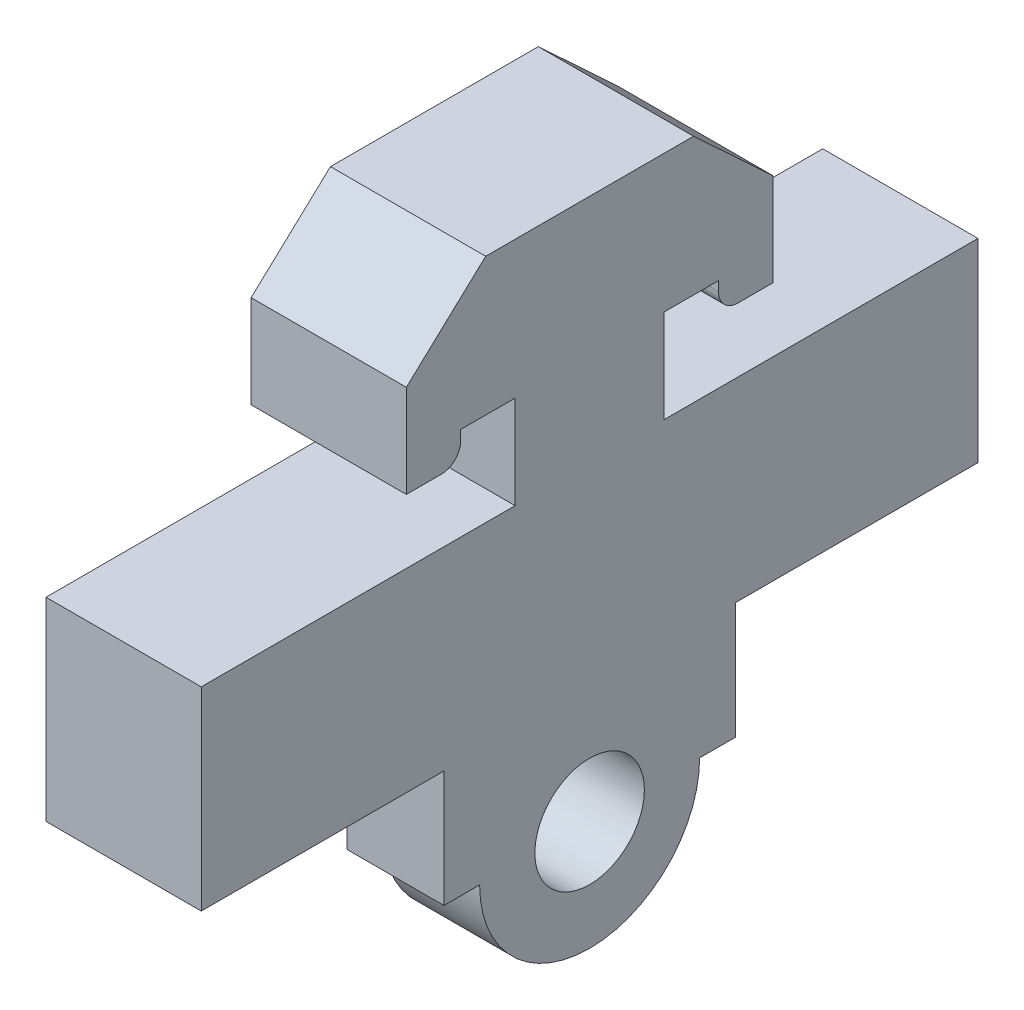
ISO-10303-21;
HEADER;
FILE_DESCRIPTION(('STEP AP214'),'2;1');
FILE_NAME('part.step','',(''),(''),'','','');
FILE_SCHEMA(('AUTOMOTIVE_DESIGN { 1 0 10303 214 1 1 1 1 }'));
ENDSEC;
DATA;
#1=APPLICATION_CONTEXT('core data for automotive mechanical design processes');
#2=APPLICATION_PROTOCOL_DEFINITION('international standard','automotive_design',2000,#1);
#3=PRODUCT_CONTEXT('',#1,'mechanical');
#4=PRODUCT('Part','Part','',(#3));
#5=PRODUCT_RELATED_PRODUCT_CATEGORY('part','',(#4));
#6=PRODUCT_DEFINITION_FORMATION('','',#4);
#7=PRODUCT_DEFINITION_CONTEXT('part definition',#1,'design');
#8=PRODUCT_DEFINITION('design','',#6,#7);
#9=PRODUCT_DEFINITION_SHAPE('','',#8);
#10=(LENGTH_UNIT() NAMED_UNIT(*) SI_UNIT(.MILLI.,.METRE.));
#11=(NAMED_UNIT(*) PLANE_ANGLE_UNIT() SI_UNIT($,.RADIAN.));
#12=(NAMED_UNIT(*) SI_UNIT($,.STERADIAN.) SOLID_ANGLE_UNIT());
#13=UNCERTAINTY_MEASURE_WITH_UNIT(LENGTH_MEASURE(1.E-05),#10,'distance_accuracy_value','');
#14=(GEOMETRIC_REPRESENTATION_CONTEXT(3) GLOBAL_UNCERTAINTY_ASSIGNED_CONTEXT((#13)) GLOBAL_UNIT_ASSIGNED_CONTEXT((#10,
#11,#12)) REPRESENTATION_CONTEXT('',''));
#15=CARTESIAN_POINT('',(0.,0.,0.));
#16=DIRECTION('',(0.,0.,1.));
#17=DIRECTION('',(1.,0.,0.));
#18=AXIS2_PLACEMENT_3D('',#15,#16,#17);
#19=CARTESIAN_POINT('',(0.,10.,0.));
#20=DIRECTION('',(0.,-1.,0.));
#21=DIRECTION('',(0.,0.,-1.));
#22=AXIS2_PLACEMENT_3D('',#19,#20,#21);
#23=PLANE('',#22);
#24=DIRECTION('',(-1.,0.,0.));
#25=VECTOR('',#24,1.);
#26=CARTESIAN_POINT('',(-37.5,10.,-20.));
#27=LINE('',#26,#25);
#28=CARTESIAN_POINT('',(42.5,10.,-20.));
#29=VERTEX_POINT('',#28);
#30=CARTESIAN_POINT('',(34.5049002985895,10.,-20.));
#31=VERTEX_POINT('',#30);
#32=EDGE_CURVE('E344',#29,#31,#27,.T.);
#33=ORIENTED_EDGE('',*,*,#32,.T.);
#34=DIRECTION('',(0.,0.,1.));
#35=VECTOR('',#34,1.);
#36=CARTESIAN_POINT('',(34.5049002985895,10.,0.));
#37=LINE('',#36,#35);
#38=CARTESIAN_POINT('',(34.5049002985895,10.,-3.83822735647703));
#39=VERTEX_POINT('',#38);
#40=EDGE_CURVE('E399',#31,#39,#37,.T.);
#41=ORIENTED_EDGE('',*,*,#40,.T.);
#42=DIRECTION('',(-1.,0.,0.));
#43=VECTOR('',#42,1.);
#44=CARTESIAN_POINT('',(64.8036979563974,10.,-3.83822735647703));
#45=LINE('',#44,#43);
#46=CARTESIAN_POINT('',(42.5,10.,-3.83822735647703));
#47=VERTEX_POINT('',#46);
#48=EDGE_CURVE('E267',#47,#39,#45,.T.);
#49=ORIENTED_EDGE('',*,*,#48,.F.);
#50=DIRECTION('',(0.,0.,1.));
#51=VECTOR('',#50,1.);
#52=CARTESIAN_POINT('',(42.5,10.,0.));
#53=LINE('',#52,#51);
#54=EDGE_CURVE('E302',#29,#47,#53,.T.);
#55=ORIENTED_EDGE('',*,*,#54,.F.);
#56=EDGE_LOOP('',(#33,#41,#49,#55));
#57=FACE_BOUND('',#56,.T.);
#58=ADVANCED_FACE('F41',(#57),#23,.F.);
#59=CARTESIAN_POINT('',(-37.5,10.,-20.));
#60=DIRECTION('',(0.,0.,1.));
#61=DIRECTION('',(1.,0.,0.));
#62=AXIS2_PLACEMENT_3D('',#59,#60,#61);
#63=PLANE('',#62);
#64=DIRECTION('',(-1.,0.,0.));
#65=VECTOR('',#64,1.);
#66=CARTESIAN_POINT('',(-37.5,0.,-20.));
#67=LINE('',#66,#65);
#68=CARTESIAN_POINT('',(42.5,0.,-20.));
#69=VERTEX_POINT('',#68);
#70=CARTESIAN_POINT('',(34.5049002985895,0.,-20.));
#71=VERTEX_POINT('',#70);
#72=EDGE_CURVE('E350',#69,#71,#67,.T.);
#73=ORIENTED_EDGE('',*,*,#72,.T.);
#74=DIRECTION('',(0.,1.,0.));
#75=VECTOR('',#74,1.);
#76=CARTESIAN_POINT('',(34.5049002985895,-50.12,-20.));
#77=LINE('',#76,#75);
#78=EDGE_CURVE('E233',#71,#31,#77,.T.);
#79=ORIENTED_EDGE('',*,*,#78,.T.);
#80=ORIENTED_EDGE('',*,*,#32,.F.);
#81=DIRECTION('',(0.,1.,0.));
#82=VECTOR('',#81,1.);
#83=CARTESIAN_POINT('',(42.5,0.,-20.));
#84=LINE('',#83,#82);
#85=EDGE_CURVE('E298',#69,#29,#84,.T.);
#86=ORIENTED_EDGE('',*,*,#85,.F.);
#87=EDGE_LOOP('',(#73,#79,#80,#86));
#88=FACE_BOUND('',#87,.T.);
#89=ADVANCED_FACE('F43',(#88),#63,.F.);
#90=CARTESIAN_POINT('',(-37.5,10.,20.));
#91=DIRECTION('',(0.,0.,-1.));
#92=DIRECTION('',(-1.,0.,0.));
#93=AXIS2_PLACEMENT_3D('',#90,#91,#92);
#94=PLANE('',#93);
#95=DIRECTION('',(1.,0.,0.));
#96=VECTOR('',#95,1.);
#97=CARTESIAN_POINT('',(-37.5,10.,20.));
#98=LINE('',#97,#96);
#99=CARTESIAN_POINT('',(34.5049002985895,10.,20.));
#100=VERTEX_POINT('',#99);
#101=CARTESIAN_POINT('',(42.5,10.,20.));
#102=VERTEX_POINT('',#101);
#103=EDGE_CURVE('E49',#100,#102,#98,.T.);
#104=ORIENTED_EDGE('',*,*,#103,.F.);
#105=DIRECTION('',(0.,1.,0.));
#106=VECTOR('',#105,1.);
#107=CARTESIAN_POINT('',(34.5049002985895,-50.12,20.));
#108=LINE('',#107,#106);
#109=CARTESIAN_POINT('',(34.5049002985895,0.,20.));
#110=VERTEX_POINT('',#109);
#111=EDGE_CURVE('E358',#110,#100,#108,.T.);
#112=ORIENTED_EDGE('',*,*,#111,.F.);
#113=DIRECTION('',(1.,0.,0.));
#114=VECTOR('',#113,1.);
#115=CARTESIAN_POINT('',(-37.5,0.,20.));
#116=LINE('',#115,#114);
#117=CARTESIAN_POINT('',(42.5,0.,20.));
#118=VERTEX_POINT('',#117);
#119=EDGE_CURVE('E347',#110,#118,#116,.T.);
#120=ORIENTED_EDGE('',*,*,#119,.T.);
#121=DIRECTION('',(0.,-1.,0.));
#122=VECTOR('',#121,1.);
#123=CARTESIAN_POINT('',(42.5,0.,20.));
#124=LINE('',#123,#122);
#125=EDGE_CURVE('E305',#102,#118,#124,.T.);
#126=ORIENTED_EDGE('',*,*,#125,.F.);
#127=EDGE_LOOP('',(#104,#112,#120,#126));
#128=FACE_BOUND('',#127,.T.);
#129=ADVANCED_FACE('F357',(#128),#94,.F.);
#130=DIRECTION('',(-1.,0.,0.));
#131=VECTOR('',#130,1.);
#132=CARTESIAN_POINT('',(64.8036979563974,10.,3.83822735647703));
#133=LINE('',#132,#131);
#134=CARTESIAN_POINT('',(42.5,10.,3.83822735647703));
#135=VERTEX_POINT('',#134);
#136=CARTESIAN_POINT('',(34.5049002985895,10.,3.83822735647703));
#137=VERTEX_POINT('',#136);
#138=EDGE_CURVE('E265',#135,#137,#133,.T.);
#139=ORIENTED_EDGE('',*,*,#138,.T.);
#140=DIRECTION('',(0.,0.,1.));
#141=VECTOR('',#140,1.);
#142=CARTESIAN_POINT('',(34.5049002985895,10.,0.));
#143=LINE('',#142,#141);
#144=EDGE_CURVE('E223',#137,#100,#143,.T.);
#145=ORIENTED_EDGE('',*,*,#144,.T.);
#146=ORIENTED_EDGE('',*,*,#103,.T.);
#147=EDGE_CURVE('E63',#135,#102,#53,.T.);
#148=ORIENTED_EDGE('',*,*,#147,.F.);
#149=EDGE_LOOP('',(#139,#145,#146,#148));
#150=FACE_BOUND('',#149,.T.);
#151=ADVANCED_FACE('F497',(#150),#23,.F.);
#152=CARTESIAN_POINT('',(0.,0.,0.));
#153=DIRECTION('',(0.,-1.,0.));
#154=DIRECTION('',(0.,0.,-1.));
#155=AXIS2_PLACEMENT_3D('',#152,#153,#154);
#156=PLANE('',#155);
#157=DIRECTION('',(0.,0.,1.));
#158=VECTOR('',#157,1.);
#159=CARTESIAN_POINT('',(34.5049002985895,0.,0.));
#160=LINE('',#159,#158);
#161=EDGE_CURVE('E281',#71,#110,#160,.T.);
#162=ORIENTED_EDGE('',*,*,#161,.F.);
#163=ORIENTED_EDGE('',*,*,#72,.F.);
#164=DIRECTION('',(0.,0.,-1.));
#165=VECTOR('',#164,1.);
#166=CARTESIAN_POINT('',(42.5,0.,0.));
#167=LINE('',#166,#165);
#168=CARTESIAN_POINT('',(42.5,0.,-7.5));
#169=VERTEX_POINT('',#168);
#170=EDGE_CURVE('E295',#169,#69,#167,.T.);
#171=ORIENTED_EDGE('',*,*,#170,.F.);
#172=DIRECTION('',(-1.,0.,0.));
#173=VECTOR('',#172,1.);
#174=CARTESIAN_POINT('',(42.5,0.,-7.5));
#175=LINE('',#174,#173);
#176=CARTESIAN_POINT('',(37.5,0.,-7.5));
#177=VERTEX_POINT('',#176);
#178=EDGE_CURVE('E331',#169,#177,#175,.T.);
#179=ORIENTED_EDGE('',*,*,#178,.T.);
#180=DIRECTION('',(0.,0.,-1.));
#181=VECTOR('',#180,1.);
#182=CARTESIAN_POINT('',(37.5,0.,20.));
#183=LINE('',#182,#181);
#184=CARTESIAN_POINT('',(37.5,0.,7.5));
#185=VERTEX_POINT('',#184);
#186=EDGE_CURVE('E343',#185,#177,#183,.T.);
#187=ORIENTED_EDGE('',*,*,#186,.F.);
#188=DIRECTION('',(-1.,0.,0.));
#189=VECTOR('',#188,1.);
#190=CARTESIAN_POINT('',(42.5,0.,7.5));
#191=LINE('',#190,#189);
#192=CARTESIAN_POINT('',(42.5,0.,7.5));
#193=VERTEX_POINT('',#192);
#194=EDGE_CURVE('E328',#193,#185,#191,.T.);
#195=ORIENTED_EDGE('',*,*,#194,.F.);
#196=EDGE_CURVE('E299',#118,#193,#167,.T.);
#197=ORIENTED_EDGE('',*,*,#196,.F.);
#198=ORIENTED_EDGE('',*,*,#119,.F.);
#199=EDGE_LOOP('',(#162,#163,#171,#179,#187,#195,#197,#198));
#200=FACE_BOUND('',#199,.T.);
#201=ADVANCED_FACE('F366',(#200),#156,.T.);
#202=CARTESIAN_POINT('',(37.5,0.,0.));
#203=DIRECTION('',(1.,0.,0.));
#204=DIRECTION('',(0.,0.,-1.));
#205=AXIS2_PLACEMENT_3D('',#202,#203,#204);
#206=PLANE('',#205);
#207=CARTESIAN_POINT('',(37.5,-6.,0.));
#208=DIRECTION('',(1.,0.,0.));
#209=DIRECTION('',(0.,0.,-1.));
#210=AXIS2_PLACEMENT_3D('',#207,#208,#209);
#211=CIRCLE('',#210,2.82);
#212=CARTESIAN_POINT('',(37.5,-6.,-2.82));
#213=VERTEX_POINT('',#212);
#214=EDGE_CURVE('E311',#213,#213,#211,.T.);
#215=ORIENTED_EDGE('',*,*,#214,.T.);
#216=EDGE_LOOP('',(#215));
#217=FACE_BOUND('',#216,.T.);
#218=DIRECTION('',(0.,-1.,0.));
#219=VECTOR('',#218,1.);
#220=CARTESIAN_POINT('',(37.5,0.,7.5));
#221=LINE('',#220,#219);
#222=CARTESIAN_POINT('',(37.5,-6.,7.5));
#223=VERTEX_POINT('',#222);
#224=EDGE_CURVE('E286',#185,#223,#221,.T.);
#225=ORIENTED_EDGE('',*,*,#224,.F.);
#226=ORIENTED_EDGE('',*,*,#186,.T.);
#227=DIRECTION('',(0.,1.,0.));
#228=VECTOR('',#227,1.);
#229=CARTESIAN_POINT('',(37.5,0.,-7.5));
#230=LINE('',#229,#228);
#231=CARTESIAN_POINT('',(37.5,-6.,-7.5));
#232=VERTEX_POINT('',#231);
#233=EDGE_CURVE('E322',#232,#177,#230,.T.);
#234=ORIENTED_EDGE('',*,*,#233,.F.);
#235=DIRECTION('',(0.,0.,-1.));
#236=VECTOR('',#235,1.);
#237=CARTESIAN_POINT('',(37.5,-6.,0.));
#238=LINE('',#237,#236);
#239=CARTESIAN_POINT('',(37.5,-6.,-5.665));
#240=VERTEX_POINT('',#239);
#241=EDGE_CURVE('E320',#240,#232,#238,.T.);
#242=ORIENTED_EDGE('',*,*,#241,.F.);
#243=CARTESIAN_POINT('',(37.5,-6.,0.));
#244=DIRECTION('',(1.,0.,0.));
#245=DIRECTION('',(0.,0.,-1.));
#246=AXIS2_PLACEMENT_3D('',#243,#244,#245);
#247=CIRCLE('',#246,5.665);
#248=CARTESIAN_POINT('',(37.5,-6.,5.665));
#249=VERTEX_POINT('',#248);
#250=EDGE_CURVE('E318',#249,#240,#247,.T.);
#251=ORIENTED_EDGE('',*,*,#250,.F.);
#252=DIRECTION('',(0.,0.,-1.));
#253=VECTOR('',#252,1.);
#254=CARTESIAN_POINT('',(37.5,-6.,0.));
#255=LINE('',#254,#253);
#256=EDGE_CURVE('E314',#223,#249,#255,.T.);
#257=ORIENTED_EDGE('',*,*,#256,.F.);
#258=EDGE_LOOP('',(#225,#226,#234,#242,#251,#257));
#259=FACE_BOUND('',#258,.T.);
#260=ADVANCED_FACE('F509',(#217,#259),#206,.F.);
#261=CARTESIAN_POINT('',(42.5,-6.,0.));
#262=DIRECTION('',(0.,1.,0.));
#263=DIRECTION('',(0.,0.,1.));
#264=AXIS2_PLACEMENT_3D('',#261,#262,#263);
#265=PLANE('',#264);
#266=ORIENTED_EDGE('',*,*,#256,.T.);
#267=DIRECTION('',(-1.,0.,0.));
#268=VECTOR('',#267,1.);
#269=CARTESIAN_POINT('',(42.5,-6.,5.665));
#270=LINE('',#269,#268);
#271=CARTESIAN_POINT('',(42.5,-6.,5.665));
#272=VERTEX_POINT('',#271);
#273=EDGE_CURVE('E340',#272,#249,#270,.T.);
#274=ORIENTED_EDGE('',*,*,#273,.F.);
#275=DIRECTION('',(0.,0.,-1.));
#276=VECTOR('',#275,1.);
#277=CARTESIAN_POINT('',(42.5,-6.,0.));
#278=LINE('',#277,#276);
#279=CARTESIAN_POINT('',(42.5,-6.,7.5));
#280=VERTEX_POINT('',#279);
#281=EDGE_CURVE('E285',#280,#272,#278,.T.);
#282=ORIENTED_EDGE('',*,*,#281,.F.);
#283=DIRECTION('',(-1.,0.,0.));
#284=VECTOR('',#283,1.);
#285=CARTESIAN_POINT('',(42.5,-6.,7.5));
#286=LINE('',#285,#284);
#287=EDGE_CURVE('E310',#280,#223,#286,.T.);
#288=ORIENTED_EDGE('',*,*,#287,.T.);
#289=EDGE_LOOP('',(#266,#274,#282,#288));
#290=FACE_BOUND('',#289,.T.);
#291=ADVANCED_FACE('F376',(#290),#265,.F.);
#292=CARTESIAN_POINT('',(42.5,-6.,0.));
#293=DIRECTION('',(-1.,0.,0.));
#294=DIRECTION('',(0.,0.,1.));
#295=AXIS2_PLACEMENT_3D('',#292,#293,#294);
#296=CYLINDRICAL_SURFACE('',#295,5.665);
#297=ORIENTED_EDGE('',*,*,#250,.T.);
#298=DIRECTION('',(-1.,0.,0.));
#299=VECTOR('',#298,1.);
#300=CARTESIAN_POINT('',(42.5,-6.,-5.665));
#301=LINE('',#300,#299);
#302=CARTESIAN_POINT('',(42.5,-6.,-5.665));
#303=VERTEX_POINT('',#302);
#304=EDGE_CURVE('E337',#303,#240,#301,.T.);
#305=ORIENTED_EDGE('',*,*,#304,.F.);
#306=CARTESIAN_POINT('',(42.5,-6.,0.));
#307=DIRECTION('',(1.,0.,0.));
#308=DIRECTION('',(0.,0.,-1.));
#309=AXIS2_PLACEMENT_3D('',#306,#307,#308);
#310=CIRCLE('',#309,5.665);
#311=EDGE_CURVE('E289',#272,#303,#310,.T.);
#312=ORIENTED_EDGE('',*,*,#311,.F.);
#313=ORIENTED_EDGE('',*,*,#273,.T.);
#314=EDGE_LOOP('',(#297,#305,#312,#313));
#315=FACE_BOUND('',#314,.T.);
#316=ADVANCED_FACE('F379',(#315),#296,.T.);
#317=CARTESIAN_POINT('',(42.5,-6.,0.));
#318=DIRECTION('',(0.,1.,0.));
#319=DIRECTION('',(0.,0.,1.));
#320=AXIS2_PLACEMENT_3D('',#317,#318,#319);
#321=PLANE('',#320);
#322=ORIENTED_EDGE('',*,*,#241,.T.);
#323=DIRECTION('',(-1.,0.,0.));
#324=VECTOR('',#323,1.);
#325=CARTESIAN_POINT('',(42.5,-6.,-7.5));
#326=LINE('',#325,#324);
#327=CARTESIAN_POINT('',(42.5,-6.,-7.5));
#328=VERTEX_POINT('',#327);
#329=EDGE_CURVE('E334',#328,#232,#326,.T.);
#330=ORIENTED_EDGE('',*,*,#329,.F.);
#331=DIRECTION('',(0.,0.,-1.));
#332=VECTOR('',#331,1.);
#333=CARTESIAN_POINT('',(42.5,-6.,0.));
#334=LINE('',#333,#332);
#335=EDGE_CURVE('E291',#303,#328,#334,.T.);
#336=ORIENTED_EDGE('',*,*,#335,.F.);
#337=ORIENTED_EDGE('',*,*,#304,.T.);
#338=EDGE_LOOP('',(#322,#330,#336,#337));
#339=FACE_BOUND('',#338,.T.);
#340=ADVANCED_FACE('F384',(#339),#321,.F.);
#341=CARTESIAN_POINT('',(42.5,0.,-7.5));
#342=DIRECTION('',(0.,0.,1.));
#343=DIRECTION('',(0.,-1.,0.));
#344=AXIS2_PLACEMENT_3D('',#341,#342,#343);
#345=PLANE('',#344);
#346=ORIENTED_EDGE('',*,*,#233,.T.);
#347=ORIENTED_EDGE('',*,*,#178,.F.);
#348=DIRECTION('',(0.,1.,0.));
#349=VECTOR('',#348,1.);
#350=CARTESIAN_POINT('',(42.5,0.,-7.5));
#351=LINE('',#350,#349);
#352=EDGE_CURVE('E293',#328,#169,#351,.T.);
#353=ORIENTED_EDGE('',*,*,#352,.F.);
#354=ORIENTED_EDGE('',*,*,#329,.T.);
#355=EDGE_LOOP('',(#346,#347,#353,#354));
#356=FACE_BOUND('',#355,.T.);
#357=ADVANCED_FACE('F390',(#356),#345,.F.);
#358=CARTESIAN_POINT('',(42.5,-6.,0.));
#359=DIRECTION('',(-1.,0.,0.));
#360=DIRECTION('',(0.,0.,1.));
#361=AXIS2_PLACEMENT_3D('',#358,#359,#360);
#362=CYLINDRICAL_SURFACE('',#361,2.82);
#363=CARTESIAN_POINT('',(42.5,-6.,0.));
#364=DIRECTION('',(1.,0.,0.));
#365=DIRECTION('',(0.,0.,-1.));
#366=AXIS2_PLACEMENT_3D('',#363,#364,#365);
#367=CIRCLE('',#366,2.82);
#368=CARTESIAN_POINT('',(42.5,-6.,-2.82));
#369=VERTEX_POINT('',#368);
#370=EDGE_CURVE('E282',#369,#369,#367,.T.);
#371=ORIENTED_EDGE('',*,*,#370,.T.);
#372=EDGE_LOOP('',(#371));
#373=FACE_BOUND('',#372,.T.);
#374=ORIENTED_EDGE('',*,*,#214,.F.);
#375=EDGE_LOOP('',(#374));
#376=FACE_BOUND('',#375,.T.);
#377=ADVANCED_FACE('F564',(#373,#376),#362,.F.);
#378=CARTESIAN_POINT('',(42.5,0.,7.5));
#379=DIRECTION('',(0.,0.,-1.));
#380=DIRECTION('',(0.,1.,0.));
#381=AXIS2_PLACEMENT_3D('',#378,#379,#380);
#382=PLANE('',#381);
#383=ORIENTED_EDGE('',*,*,#224,.T.);
#384=ORIENTED_EDGE('',*,*,#287,.F.);
#385=DIRECTION('',(0.,-1.,0.));
#386=VECTOR('',#385,1.);
#387=CARTESIAN_POINT('',(42.5,0.,7.5));
#388=LINE('',#387,#386);
#389=EDGE_CURVE('E308',#193,#280,#388,.T.);
#390=ORIENTED_EDGE('',*,*,#389,.F.);
#391=ORIENTED_EDGE('',*,*,#194,.T.);
#392=EDGE_LOOP('',(#383,#384,#390,#391));
#393=FACE_BOUND('',#392,.T.);
#394=ADVANCED_FACE('F371',(#393),#382,.F.);
#395=CARTESIAN_POINT('',(42.5,0.,0.));
#396=DIRECTION('',(1.,0.,0.));
#397=DIRECTION('',(0.,0.,-1.));
#398=AXIS2_PLACEMENT_3D('',#395,#396,#397);
#399=PLANE('',#398);
#400=ORIENTED_EDGE('',*,*,#370,.F.);
#401=EDGE_LOOP('',(#400));
#402=FACE_BOUND('',#401,.T.);
#403=ORIENTED_EDGE('',*,*,#281,.T.);
#404=ORIENTED_EDGE('',*,*,#311,.T.);
#405=ORIENTED_EDGE('',*,*,#335,.T.);
#406=ORIENTED_EDGE('',*,*,#352,.T.);
#407=ORIENTED_EDGE('',*,*,#170,.T.);
#408=ORIENTED_EDGE('',*,*,#85,.T.);
#409=ORIENTED_EDGE('',*,*,#54,.T.);
#410=DIRECTION('',(0.,1.,0.));
#411=VECTOR('',#410,1.);
#412=CARTESIAN_POINT('',(42.5,0.,-3.83822735647703));
#413=LINE('',#412,#411);
#414=CARTESIAN_POINT('',(42.5,14.8,-3.83822735647703));
#415=VERTEX_POINT('',#414);
#416=EDGE_CURVE('E405',#47,#415,#413,.T.);
#417=ORIENTED_EDGE('',*,*,#416,.T.);
#418=DIRECTION('',(0.,0.,-1.));
#419=VECTOR('',#418,1.);
#420=CARTESIAN_POINT('',(42.5,14.8,0.));
#421=LINE('',#420,#419);
#422=CARTESIAN_POINT('',(42.5,14.8,-6.63822735647704));
#423=VERTEX_POINT('',#422);
#424=EDGE_CURVE('E315',#415,#423,#421,.T.);
#425=ORIENTED_EDGE('',*,*,#424,.T.);
#426=DIRECTION('',(0.,-1.,0.));
#427=VECTOR('',#426,1.);
#428=CARTESIAN_POINT('',(42.5,0.,-6.63822735647704));
#429=LINE('',#428,#427);
#430=CARTESIAN_POINT('',(42.5,14.3,-6.63822735647704));
#431=VERTEX_POINT('',#430);
#432=EDGE_CURVE('E276',#423,#431,#429,.T.);
#433=ORIENTED_EDGE('',*,*,#432,.T.);
#434=CARTESIAN_POINT('',(42.5,14.3,-7.63822735647704));
#435=DIRECTION('',(1.,0.,0.));
#436=DIRECTION('',(0.,0.,-1.));
#437=AXIS2_PLACEMENT_3D('',#434,#435,#436);
#438=CIRCLE('',#437,1.);
#439=CARTESIAN_POINT('',(42.5,13.3,-7.63822735647704));
#440=VERTEX_POINT('',#439);
#441=EDGE_CURVE('E430',#431,#440,#438,.T.);
#442=ORIENTED_EDGE('',*,*,#441,.T.);
#443=DIRECTION('',(0.,0.,-1.));
#444=VECTOR('',#443,1.);
#445=CARTESIAN_POINT('',(42.5,13.3,0.));
#446=LINE('',#445,#444);
#447=CARTESIAN_POINT('',(42.5,13.3,-9.43822735647704));
#448=VERTEX_POINT('',#447);
#449=EDGE_CURVE('E424',#440,#448,#446,.T.);
#450=ORIENTED_EDGE('',*,*,#449,.T.);
#451=DIRECTION('',(0.,-1.,0.));
#452=VECTOR('',#451,1.);
#453=CARTESIAN_POINT('',(42.5,0.,-9.43822735647704));
#454=LINE('',#453,#452);
#455=CARTESIAN_POINT('',(42.5,18.08,-9.43822735647704));
#456=VERTEX_POINT('',#455);
#457=EDGE_CURVE('E425',#456,#448,#454,.T.);
#458=ORIENTED_EDGE('',*,*,#457,.F.);
#459=DIRECTION('',(0.,0.681003584229391,0.732280081844865));
#460=VECTOR('',#459,1.);
#461=CARTESIAN_POINT('',(42.5,14.4018186690279,-13.393359147938));
#462=LINE('',#461,#460);
#463=CARTESIAN_POINT('',(42.5,21.88,-5.35210449978269));
#464=VERTEX_POINT('',#463);
#465=EDGE_CURVE('E421',#456,#464,#462,.T.);
#466=ORIENTED_EDGE('',*,*,#465,.T.);
#467=DIRECTION('',(0.,0.,1.));
#468=VECTOR('',#467,1.);
#469=CARTESIAN_POINT('',(42.5,21.88,0.));
#470=LINE('',#469,#468);
#471=CARTESIAN_POINT('',(42.5,21.88,5.35210449978269));
#472=VERTEX_POINT('',#471);
#473=EDGE_CURVE('E411',#464,#472,#470,.T.);
#474=ORIENTED_EDGE('',*,*,#473,.T.);
#475=DIRECTION('',(0.,0.681003584229391,-0.732280081844865));
#476=VECTOR('',#475,1.);
#477=CARTESIAN_POINT('',(42.5,14.4018186690279,13.393359147938));
#478=LINE('',#477,#476);
#479=CARTESIAN_POINT('',(42.5,18.08,9.43822735647704));
#480=VERTEX_POINT('',#479);
#481=EDGE_CURVE('E237',#480,#472,#478,.T.);
#482=ORIENTED_EDGE('',*,*,#481,.F.);
#483=DIRECTION('',(0.,-1.,0.));
#484=VECTOR('',#483,1.);
#485=CARTESIAN_POINT('',(42.5,0.,9.43822735647704));
#486=LINE('',#485,#484);
#487=CARTESIAN_POINT('',(42.5,13.3,9.43822735647704));
#488=VERTEX_POINT('',#487);
#489=EDGE_CURVE('E407',#480,#488,#486,.T.);
#490=ORIENTED_EDGE('',*,*,#489,.T.);
#491=DIRECTION('',(0.,0.,1.));
#492=VECTOR('',#491,1.);
#493=CARTESIAN_POINT('',(42.5,13.3,0.));
#494=LINE('',#493,#492);
#495=CARTESIAN_POINT('',(42.5,13.3,7.63822735647704));
#496=VERTEX_POINT('',#495);
#497=EDGE_CURVE('E240',#496,#488,#494,.T.);
#498=ORIENTED_EDGE('',*,*,#497,.F.);
#499=CARTESIAN_POINT('',(42.5,14.3,7.63822735647704));
#500=DIRECTION('',(1.,0.,0.));
#501=DIRECTION('',(0.,0.,-1.));
#502=AXIS2_PLACEMENT_3D('',#499,#500,#501);
#503=CIRCLE('',#502,1.);
#504=CARTESIAN_POINT('',(42.5,14.3,6.63822735647704));
#505=VERTEX_POINT('',#504);
#506=EDGE_CURVE('E249',#505,#496,#503,.F.);
#507=ORIENTED_EDGE('',*,*,#506,.F.);
#508=DIRECTION('',(0.,-1.,0.));
#509=VECTOR('',#508,1.);
#510=CARTESIAN_POINT('',(42.5,0.,6.63822735647704));
#511=LINE('',#510,#509);
#512=CARTESIAN_POINT('',(42.5,14.8,6.63822735647704));
#513=VERTEX_POINT('',#512);
#514=EDGE_CURVE('E253',#513,#505,#511,.T.);
#515=ORIENTED_EDGE('',*,*,#514,.F.);
#516=DIRECTION('',(0.,0.,1.));
#517=VECTOR('',#516,1.);
#518=CARTESIAN_POINT('',(42.5,14.8,0.));
#519=LINE('',#518,#517);
#520=CARTESIAN_POINT('',(42.5,14.8,3.83822735647703));
#521=VERTEX_POINT('',#520);
#522=EDGE_CURVE('E257',#521,#513,#519,.T.);
#523=ORIENTED_EDGE('',*,*,#522,.F.);
#524=DIRECTION('',(0.,1.,0.));
#525=VECTOR('',#524,1.);
#526=CARTESIAN_POINT('',(42.5,0.,3.83822735647703));
#527=LINE('',#526,#525);
#528=EDGE_CURVE('E261',#135,#521,#527,.T.);
#529=ORIENTED_EDGE('',*,*,#528,.F.);
#530=ORIENTED_EDGE('',*,*,#147,.T.);
#531=ORIENTED_EDGE('',*,*,#125,.T.);
#532=ORIENTED_EDGE('',*,*,#196,.T.);
#533=ORIENTED_EDGE('',*,*,#389,.T.);
#534=EDGE_LOOP('',(#403,#404,#405,#406,#407,#408,#409,#417,#425,#433,#442,#450,#458,#466,#474,
#482,#490,#498,#507,#515,#523,#529,#530,#531,#532,#533));
#535=FACE_BOUND('',#534,.T.);
#536=ADVANCED_FACE('F363',(#402,#535),#399,.T.);
#537=CARTESIAN_POINT('',(64.8036979563974,14.3,-7.63822735647704));
#538=DIRECTION('',(-1.,0.,0.));
#539=DIRECTION('',(0.,0.,1.));
#540=AXIS2_PLACEMENT_3D('',#537,#538,#539);
#541=CYLINDRICAL_SURFACE('',#540,1.);
#542=DIRECTION('',(-1.,0.,0.));
#543=VECTOR('',#542,1.);
#544=CARTESIAN_POINT('',(64.8036979563974,14.3,-6.63822735647704));
#545=LINE('',#544,#543);
#546=CARTESIAN_POINT('',(34.5049002985895,14.3,-6.63822735647704));
#547=VERTEX_POINT('',#546);
#548=EDGE_CURVE('E277',#431,#547,#545,.T.);
#549=ORIENTED_EDGE('',*,*,#548,.T.);
#550=CARTESIAN_POINT('',(34.5049002985895,14.3,-7.63822735647704));
#551=DIRECTION('',(1.,0.,0.));
#552=DIRECTION('',(0.,0.,-1.));
#553=AXIS2_PLACEMENT_3D('',#550,#551,#552);
#554=CIRCLE('',#553,1.);
#555=CARTESIAN_POINT('',(34.5049002985895,13.3,-7.63822735647704));
#556=VERTEX_POINT('',#555);
#557=EDGE_CURVE('E56',#547,#556,#554,.T.);
#558=ORIENTED_EDGE('',*,*,#557,.T.);
#559=DIRECTION('',(-1.,0.,0.));
#560=VECTOR('',#559,1.);
#561=CARTESIAN_POINT('',(64.8036979563974,13.3,-7.63822735647704));
#562=LINE('',#561,#560);
#563=EDGE_CURVE('E280',#440,#556,#562,.T.);
#564=ORIENTED_EDGE('',*,*,#563,.F.);
#565=ORIENTED_EDGE('',*,*,#441,.F.);
#566=EDGE_LOOP('',(#549,#558,#564,#565));
#567=FACE_BOUND('',#566,.T.);
#568=ADVANCED_FACE('F456',(#567),#541,.T.);
#569=CARTESIAN_POINT('',(64.8036979563974,13.3,0.));
#570=DIRECTION('',(0.,1.,0.));
#571=DIRECTION('',(0.,0.,1.));
#572=AXIS2_PLACEMENT_3D('',#569,#570,#571);
#573=PLANE('',#572);
#574=ORIENTED_EDGE('',*,*,#563,.T.);
#575=DIRECTION('',(0.,0.,-1.));
#576=VECTOR('',#575,1.);
#577=CARTESIAN_POINT('',(34.5049002985895,13.3,0.));
#578=LINE('',#577,#576);
#579=CARTESIAN_POINT('',(34.5049002985895,13.3,-9.43822735647704));
#580=VERTEX_POINT('',#579);
#581=EDGE_CURVE('E458',#556,#580,#578,.T.);
#582=ORIENTED_EDGE('',*,*,#581,.T.);
#583=DIRECTION('',(-1.,0.,0.));
#584=VECTOR('',#583,1.);
#585=CARTESIAN_POINT('',(64.8036979563974,13.3,-9.43822735647704));
#586=LINE('',#585,#584);
#587=EDGE_CURVE('E427',#448,#580,#586,.T.);
#588=ORIENTED_EDGE('',*,*,#587,.F.);
#589=ORIENTED_EDGE('',*,*,#449,.F.);
#590=EDGE_LOOP('',(#574,#582,#588,#589));
#591=FACE_BOUND('',#590,.T.);
#592=ADVANCED_FACE('F453',(#591),#573,.F.);
#593=CARTESIAN_POINT('',(64.8036979563974,0.,-9.43822735647704));
#594=DIRECTION('',(0.,0.,-1.));
#595=DIRECTION('',(-1.,0.,0.));
#596=AXIS2_PLACEMENT_3D('',#593,#594,#595);
#597=PLANE('',#596);
#598=DIRECTION('',(0.,-1.,0.));
#599=VECTOR('',#598,1.);
#600=CARTESIAN_POINT('',(34.5049002985895,0.,-9.43822735647704));
#601=LINE('',#600,#599);
#602=CARTESIAN_POINT('',(34.5049002985895,18.08,-9.43822735647704));
#603=VERTEX_POINT('',#602);
#604=EDGE_CURVE('E449',#603,#580,#601,.T.);
#605=ORIENTED_EDGE('',*,*,#604,.F.);
#606=DIRECTION('',(-1.,0.,0.));
#607=VECTOR('',#606,1.);
#608=CARTESIAN_POINT('',(64.8036979563974,18.08,-9.43822735647704));
#609=LINE('',#608,#607);
#610=EDGE_CURVE('E438',#456,#603,#609,.T.);
#611=ORIENTED_EDGE('',*,*,#610,.F.);
#612=ORIENTED_EDGE('',*,*,#457,.T.);
#613=ORIENTED_EDGE('',*,*,#587,.T.);
#614=EDGE_LOOP('',(#605,#611,#612,#613));
#615=FACE_BOUND('',#614,.T.);
#616=ADVANCED_FACE('F447',(#615),#597,.T.);
#617=CARTESIAN_POINT('',(64.8036979563974,14.4018186690279,-13.393359147938));
#618=DIRECTION('',(0.,-0.732280081844865,0.681003584229391));
#619=DIRECTION('',(0.,-0.681003584229391,-0.732280081844865));
#620=AXIS2_PLACEMENT_3D('',#617,#618,#619);
#621=PLANE('',#620);
#622=ORIENTED_EDGE('',*,*,#610,.T.);
#623=DIRECTION('',(0.,0.681003584229391,0.732280081844865));
#624=VECTOR('',#623,1.);
#625=CARTESIAN_POINT('',(34.5049002985895,14.4018186690279,-13.393359147938));
#626=LINE('',#625,#624);
#627=CARTESIAN_POINT('',(34.5049002985895,21.88,-5.35210449978269));
#628=VERTEX_POINT('',#627);
#629=EDGE_CURVE('E443',#603,#628,#626,.T.);
#630=ORIENTED_EDGE('',*,*,#629,.T.);
#631=DIRECTION('',(-1.,0.,0.));
#632=VECTOR('',#631,1.);
#633=CARTESIAN_POINT('',(64.8036979563974,21.88,-5.35210449978269));
#634=LINE('',#633,#632);
#635=EDGE_CURVE('E232',#464,#628,#634,.T.);
#636=ORIENTED_EDGE('',*,*,#635,.F.);
#637=ORIENTED_EDGE('',*,*,#465,.F.);
#638=EDGE_LOOP('',(#622,#630,#636,#637));
#639=FACE_BOUND('',#638,.T.);
#640=ADVANCED_FACE('F442',(#639),#621,.F.);
#641=CARTESIAN_POINT('',(64.8036979563974,21.88,0.));
#642=DIRECTION('',(0.,-1.,0.));
#643=DIRECTION('',(0.,0.,-1.));
#644=AXIS2_PLACEMENT_3D('',#641,#642,#643);
#645=PLANE('',#644);
#646=ORIENTED_EDGE('',*,*,#635,.T.);
#647=DIRECTION('',(0.,0.,-1.));
#648=VECTOR('',#647,1.);
#649=CARTESIAN_POINT('',(34.5049002985895,21.88,-20.));
#650=LINE('',#649,#648);
#651=CARTESIAN_POINT('',(34.5049002985895,21.88,5.35210449978268));
#652=VERTEX_POINT('',#651);
#653=EDGE_CURVE('E215',#652,#628,#650,.T.);
#654=ORIENTED_EDGE('',*,*,#653,.F.);
#655=DIRECTION('',(-1.,0.,0.));
#656=VECTOR('',#655,1.);
#657=CARTESIAN_POINT('',(64.8036979563974,21.88,5.35210449978269));
#658=LINE('',#657,#656);
#659=EDGE_CURVE('E229',#472,#652,#658,.T.);
#660=ORIENTED_EDGE('',*,*,#659,.F.);
#661=ORIENTED_EDGE('',*,*,#473,.F.);
#662=EDGE_LOOP('',(#646,#654,#660,#661));
#663=FACE_BOUND('',#662,.T.);
#664=ADVANCED_FACE('F228',(#663),#645,.F.);
#665=CARTESIAN_POINT('',(64.8036979563974,14.4018186690279,13.393359147938));
#666=DIRECTION('',(0.,0.732280081844865,0.681003584229391));
#667=DIRECTION('',(0.,-0.681003584229391,0.732280081844865));
#668=AXIS2_PLACEMENT_3D('',#665,#666,#667);
#669=PLANE('',#668);
#670=DIRECTION('',(0.,0.681003584229391,-0.732280081844865));
#671=VECTOR('',#670,1.);
#672=CARTESIAN_POINT('',(34.5049002985895,14.4018186690279,13.393359147938));
#673=LINE('',#672,#671);
#674=CARTESIAN_POINT('',(34.5049002985895,18.08,9.43822735647704));
#675=VERTEX_POINT('',#674);
#676=EDGE_CURVE('E212',#675,#652,#673,.T.);
#677=ORIENTED_EDGE('',*,*,#676,.F.);
#678=DIRECTION('',(-1.,0.,0.));
#679=VECTOR('',#678,1.);
#680=CARTESIAN_POINT('',(64.8036979563974,18.08,9.43822735647704));
#681=LINE('',#680,#679);
#682=EDGE_CURVE('E238',#480,#675,#681,.T.);
#683=ORIENTED_EDGE('',*,*,#682,.F.);
#684=ORIENTED_EDGE('',*,*,#481,.T.);
#685=ORIENTED_EDGE('',*,*,#659,.T.);
#686=EDGE_LOOP('',(#677,#683,#684,#685));
#687=FACE_BOUND('',#686,.T.);
#688=ADVANCED_FACE('F235',(#687),#669,.T.);
#689=CARTESIAN_POINT('',(64.8036979563974,0.,9.43822735647704));
#690=DIRECTION('',(0.,0.,-1.));
#691=DIRECTION('',(-1.,0.,0.));
#692=AXIS2_PLACEMENT_3D('',#689,#690,#691);
#693=PLANE('',#692);
#694=ORIENTED_EDGE('',*,*,#682,.T.);
#695=DIRECTION('',(0.,-1.,0.));
#696=VECTOR('',#695,1.);
#697=CARTESIAN_POINT('',(34.5049002985895,0.,9.43822735647704));
#698=LINE('',#697,#696);
#699=CARTESIAN_POINT('',(34.5049002985895,13.3,9.43822735647704));
#700=VERTEX_POINT('',#699);
#701=EDGE_CURVE('E218',#675,#700,#698,.T.);
#702=ORIENTED_EDGE('',*,*,#701,.T.);
#703=DIRECTION('',(-1.,0.,0.));
#704=VECTOR('',#703,1.);
#705=CARTESIAN_POINT('',(64.8036979563974,13.3,9.43822735647704));
#706=LINE('',#705,#704);
#707=EDGE_CURVE('E246',#488,#700,#706,.T.);
#708=ORIENTED_EDGE('',*,*,#707,.F.);
#709=ORIENTED_EDGE('',*,*,#489,.F.);
#710=EDGE_LOOP('',(#694,#702,#708,#709));
#711=FACE_BOUND('',#710,.T.);
#712=ADVANCED_FACE('F535',(#711),#693,.F.);
#713=CARTESIAN_POINT('',(64.8036979563974,13.3,0.));
#714=DIRECTION('',(0.,-1.,0.));
#715=DIRECTION('',(0.,0.,-1.));
#716=AXIS2_PLACEMENT_3D('',#713,#714,#715);
#717=PLANE('',#716);
#718=DIRECTION('',(0.,0.,1.));
#719=VECTOR('',#718,1.);
#720=CARTESIAN_POINT('',(34.5049002985895,13.3,0.));
#721=LINE('',#720,#719);
#722=CARTESIAN_POINT('',(34.5049002985895,13.3,7.63822735647704));
#723=VERTEX_POINT('',#722);
#724=EDGE_CURVE('E475',#723,#700,#721,.T.);
#725=ORIENTED_EDGE('',*,*,#724,.F.);
#726=DIRECTION('',(-1.,0.,0.));
#727=VECTOR('',#726,1.);
#728=CARTESIAN_POINT('',(64.8036979563974,13.3,7.63822735647704));
#729=LINE('',#728,#727);
#730=EDGE_CURVE('E250',#496,#723,#729,.T.);
#731=ORIENTED_EDGE('',*,*,#730,.F.);
#732=ORIENTED_EDGE('',*,*,#497,.T.);
#733=ORIENTED_EDGE('',*,*,#707,.T.);
#734=EDGE_LOOP('',(#725,#731,#732,#733));
#735=FACE_BOUND('',#734,.T.);
#736=ADVANCED_FACE('F532',(#735),#717,.T.);
#737=CARTESIAN_POINT('',(64.8036979563974,14.3,7.63822735647704));
#738=DIRECTION('',(-1.,0.,0.));
#739=DIRECTION('',(0.,0.,1.));
#740=AXIS2_PLACEMENT_3D('',#737,#738,#739);
#741=CYLINDRICAL_SURFACE('',#740,1.);
#742=CARTESIAN_POINT('',(34.5049002985895,14.3,7.63822735647704));
#743=DIRECTION('',(1.,0.,0.));
#744=DIRECTION('',(0.,0.,-1.));
#745=AXIS2_PLACEMENT_3D('',#742,#743,#744);
#746=CIRCLE('',#745,1.);
#747=CARTESIAN_POINT('',(34.5049002985895,14.3,6.63822735647704));
#748=VERTEX_POINT('',#747);
#749=EDGE_CURVE('E473',#748,#723,#746,.F.);
#750=ORIENTED_EDGE('',*,*,#749,.F.);
#751=DIRECTION('',(-1.,0.,0.));
#752=VECTOR('',#751,1.);
#753=CARTESIAN_POINT('',(64.8036979563974,14.3,6.63822735647704));
#754=LINE('',#753,#752);
#755=EDGE_CURVE('E254',#505,#748,#754,.T.);
#756=ORIENTED_EDGE('',*,*,#755,.F.);
#757=ORIENTED_EDGE('',*,*,#506,.T.);
#758=ORIENTED_EDGE('',*,*,#730,.T.);
#759=EDGE_LOOP('',(#750,#756,#757,#758));
#760=FACE_BOUND('',#759,.T.);
#761=ADVANCED_FACE('F528',(#760),#741,.T.);
#762=CARTESIAN_POINT('',(64.8036979563974,0.,6.63822735647704));
#763=DIRECTION('',(0.,0.,-1.));
#764=DIRECTION('',(-1.,0.,0.));
#765=AXIS2_PLACEMENT_3D('',#762,#763,#764);
#766=PLANE('',#765);
#767=DIRECTION('',(0.,-1.,0.));
#768=VECTOR('',#767,1.);
#769=CARTESIAN_POINT('',(34.5049002985895,0.,6.63822735647704));
#770=LINE('',#769,#768);
#771=CARTESIAN_POINT('',(34.5049002985895,14.8,6.63822735647704));
#772=VERTEX_POINT('',#771);
#773=EDGE_CURVE('E471',#772,#748,#770,.T.);
#774=ORIENTED_EDGE('',*,*,#773,.F.);
#775=DIRECTION('',(-1.,0.,0.));
#776=VECTOR('',#775,1.);
#777=CARTESIAN_POINT('',(64.8036979563974,14.8,6.63822735647704));
#778=LINE('',#777,#776);
#779=EDGE_CURVE('E258',#513,#772,#778,.T.);
#780=ORIENTED_EDGE('',*,*,#779,.F.);
#781=ORIENTED_EDGE('',*,*,#514,.T.);
#782=ORIENTED_EDGE('',*,*,#755,.T.);
#783=EDGE_LOOP('',(#774,#780,#781,#782));
#784=FACE_BOUND('',#783,.T.);
#785=ADVANCED_FACE('F523',(#784),#766,.T.);
#786=CARTESIAN_POINT('',(64.8036979563974,14.8,0.));
#787=DIRECTION('',(0.,-1.,0.));
#788=DIRECTION('',(0.,0.,-1.));
#789=AXIS2_PLACEMENT_3D('',#786,#787,#788);
#790=PLANE('',#789);
#791=DIRECTION('',(0.,0.,1.));
#792=VECTOR('',#791,1.);
#793=CARTESIAN_POINT('',(34.5049002985895,14.8,0.));
#794=LINE('',#793,#792);
#795=CARTESIAN_POINT('',(34.5049002985895,14.8,3.83822735647703));
#796=VERTEX_POINT('',#795);
#797=EDGE_CURVE('E469',#796,#772,#794,.T.);
#798=ORIENTED_EDGE('',*,*,#797,.F.);
#799=DIRECTION('',(-1.,0.,0.));
#800=VECTOR('',#799,1.);
#801=CARTESIAN_POINT('',(64.8036979563974,14.8,3.83822735647703));
#802=LINE('',#801,#800);
#803=EDGE_CURVE('E262',#521,#796,#802,.T.);
#804=ORIENTED_EDGE('',*,*,#803,.F.);
#805=ORIENTED_EDGE('',*,*,#522,.T.);
#806=ORIENTED_EDGE('',*,*,#779,.T.);
#807=EDGE_LOOP('',(#798,#804,#805,#806));
#808=FACE_BOUND('',#807,.T.);
#809=ADVANCED_FACE('F520',(#808),#790,.T.);
#810=CARTESIAN_POINT('',(64.8036979563974,0.,3.83822735647703));
#811=DIRECTION('',(0.,0.,1.));
#812=DIRECTION('',(1.,0.,0.));
#813=AXIS2_PLACEMENT_3D('',#810,#811,#812);
#814=PLANE('',#813);
#815=DIRECTION('',(0.,1.,0.));
#816=VECTOR('',#815,1.);
#817=CARTESIAN_POINT('',(34.5049002985895,0.,3.83822735647703));
#818=LINE('',#817,#816);
#819=EDGE_CURVE('E467',#137,#796,#818,.T.);
#820=ORIENTED_EDGE('',*,*,#819,.F.);
#821=ORIENTED_EDGE('',*,*,#138,.F.);
#822=ORIENTED_EDGE('',*,*,#528,.T.);
#823=ORIENTED_EDGE('',*,*,#803,.T.);
#824=EDGE_LOOP('',(#820,#821,#822,#823));
#825=FACE_BOUND('',#824,.T.);
#826=ADVANCED_FACE('F512',(#825),#814,.T.);
#827=CARTESIAN_POINT('',(64.8036979563974,0.,-3.83822735647703));
#828=DIRECTION('',(0.,0.,1.));
#829=DIRECTION('',(1.,0.,0.));
#830=AXIS2_PLACEMENT_3D('',#827,#828,#829);
#831=PLANE('',#830);
#832=ORIENTED_EDGE('',*,*,#48,.T.);
#833=DIRECTION('',(0.,1.,0.));
#834=VECTOR('',#833,1.);
#835=CARTESIAN_POINT('',(34.5049002985895,0.,-3.83822735647703));
#836=LINE('',#835,#834);
#837=CARTESIAN_POINT('',(34.5049002985895,14.8,-3.83822735647703));
#838=VERTEX_POINT('',#837);
#839=EDGE_CURVE('E404',#39,#838,#836,.T.);
#840=ORIENTED_EDGE('',*,*,#839,.T.);
#841=DIRECTION('',(-1.,0.,0.));
#842=VECTOR('',#841,1.);
#843=CARTESIAN_POINT('',(64.8036979563974,14.8,-3.83822735647703));
#844=LINE('',#843,#842);
#845=EDGE_CURVE('E270',#415,#838,#844,.T.);
#846=ORIENTED_EDGE('',*,*,#845,.F.);
#847=ORIENTED_EDGE('',*,*,#416,.F.);
#848=EDGE_LOOP('',(#832,#840,#846,#847));
#849=FACE_BOUND('',#848,.T.);
#850=ADVANCED_FACE('F402',(#849),#831,.F.);
#851=CARTESIAN_POINT('',(64.8036979563974,14.8,0.));
#852=DIRECTION('',(0.,1.,0.));
#853=DIRECTION('',(0.,0.,1.));
#854=AXIS2_PLACEMENT_3D('',#851,#852,#853);
#855=PLANE('',#854);
#856=ORIENTED_EDGE('',*,*,#845,.T.);
#857=DIRECTION('',(0.,0.,-1.));
#858=VECTOR('',#857,1.);
#859=CARTESIAN_POINT('',(34.5049002985895,14.8,0.));
#860=LINE('',#859,#858);
#861=CARTESIAN_POINT('',(34.5049002985895,14.8,-6.63822735647704));
#862=VERTEX_POINT('',#861);
#863=EDGE_CURVE('E460',#838,#862,#860,.T.);
#864=ORIENTED_EDGE('',*,*,#863,.T.);
#865=DIRECTION('',(-1.,0.,0.));
#866=VECTOR('',#865,1.);
#867=CARTESIAN_POINT('',(64.8036979563974,14.8,-6.63822735647704));
#868=LINE('',#867,#866);
#869=EDGE_CURVE('E273',#423,#862,#868,.T.);
#870=ORIENTED_EDGE('',*,*,#869,.F.);
#871=ORIENTED_EDGE('',*,*,#424,.F.);
#872=EDGE_LOOP('',(#856,#864,#870,#871));
#873=FACE_BOUND('',#872,.T.);
#874=ADVANCED_FACE('F483',(#873),#855,.F.);
#875=CARTESIAN_POINT('',(64.8036979563974,0.,-6.63822735647704));
#876=DIRECTION('',(0.,0.,-1.));
#877=DIRECTION('',(-1.,0.,0.));
#878=AXIS2_PLACEMENT_3D('',#875,#876,#877);
#879=PLANE('',#878);
#880=ORIENTED_EDGE('',*,*,#869,.T.);
#881=DIRECTION('',(0.,-1.,0.));
#882=VECTOR('',#881,1.);
#883=CARTESIAN_POINT('',(34.5049002985895,0.,-6.63822735647704));
#884=LINE('',#883,#882);
#885=EDGE_CURVE('E11',#862,#547,#884,.T.);
#886=ORIENTED_EDGE('',*,*,#885,.T.);
#887=ORIENTED_EDGE('',*,*,#548,.F.);
#888=ORIENTED_EDGE('',*,*,#432,.F.);
#889=EDGE_LOOP('',(#880,#886,#887,#888));
#890=FACE_BOUND('',#889,.T.);
#891=ADVANCED_FACE('F486',(#890),#879,.F.);
#892=CARTESIAN_POINT('',(34.5049002985895,-50.12,-20.));
#893=DIRECTION('',(1.,0.,0.));
#894=DIRECTION('',(0.,0.,-1.));
#895=AXIS2_PLACEMENT_3D('',#892,#893,#894);
#896=PLANE('',#895);
#897=ORIENTED_EDGE('',*,*,#161,.T.);
#898=ORIENTED_EDGE('',*,*,#111,.T.);
#899=ORIENTED_EDGE('',*,*,#144,.F.);
#900=ORIENTED_EDGE('',*,*,#819,.T.);
#901=ORIENTED_EDGE('',*,*,#797,.T.);
#902=ORIENTED_EDGE('',*,*,#773,.T.);
#903=ORIENTED_EDGE('',*,*,#749,.T.);
#904=ORIENTED_EDGE('',*,*,#724,.T.);
#905=ORIENTED_EDGE('',*,*,#701,.F.);
#906=ORIENTED_EDGE('',*,*,#676,.T.);
#907=ORIENTED_EDGE('',*,*,#653,.T.);
#908=ORIENTED_EDGE('',*,*,#629,.F.);
#909=ORIENTED_EDGE('',*,*,#604,.T.);
#910=ORIENTED_EDGE('',*,*,#581,.F.);
#911=ORIENTED_EDGE('',*,*,#557,.F.);
#912=ORIENTED_EDGE('',*,*,#885,.F.);
#913=ORIENTED_EDGE('',*,*,#863,.F.);
#914=ORIENTED_EDGE('',*,*,#839,.F.);
#915=ORIENTED_EDGE('',*,*,#40,.F.);
#916=ORIENTED_EDGE('',*,*,#78,.F.);
#917=EDGE_LOOP('',(#897,#898,#899,#900,#901,#902,#903,#904,#905,#906,#907,#908,#909,#910,#911,
#912,#913,#914,#915,#916));
#918=FACE_BOUND('',#917,.T.);
#919=ADVANCED_FACE('F214',(#918),#896,.F.);
#920=CLOSED_SHELL('',(#58,#89,#129,#151,#201,#260,#291,#316,#340,#357,#377,#394,#536,#568,#592,
#616,#640,#664,#688,#712,#736,#761,#785,#809,#826,#850,#874,#891,#919));
#921=MANIFOLD_SOLID_BREP('B2',#920);
#922=ADVANCED_BREP_SHAPE_REPRESENTATION('',(#18,#921),#14);
#923=SHAPE_DEFINITION_REPRESENTATION(#9,#922);
ENDSEC;
END-ISO-10303-21;
